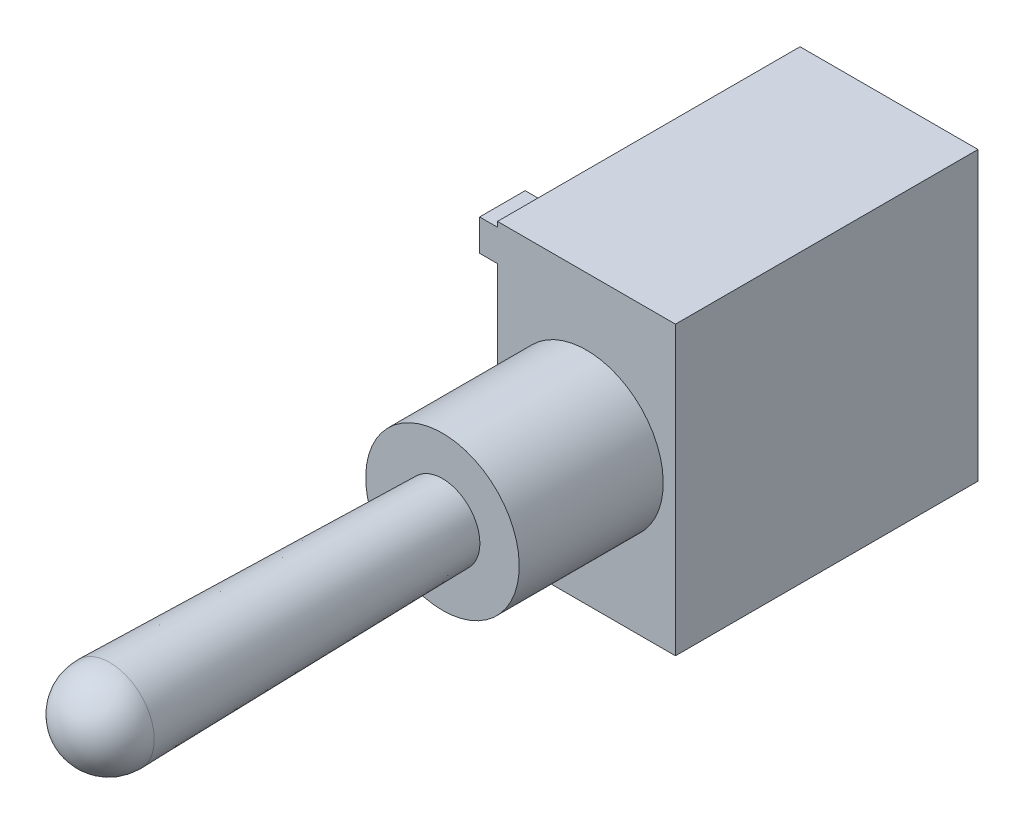
ISO-10303-21;
HEADER;
FILE_DESCRIPTION(('STEP AP214'),'2;1');
FILE_NAME('part.step','',(''),(''),'','','');
FILE_SCHEMA(('AUTOMOTIVE_DESIGN { 1 0 10303 214 1 1 1 1 }'));
ENDSEC;
DATA;
#1=APPLICATION_CONTEXT('core data for automotive mechanical design processes');
#2=APPLICATION_PROTOCOL_DEFINITION('international standard','automotive_design',2000,#1);
#3=PRODUCT_CONTEXT('',#1,'mechanical');
#4=PRODUCT('Part','Part','',(#3));
#5=PRODUCT_RELATED_PRODUCT_CATEGORY('part','',(#4));
#6=PRODUCT_DEFINITION_FORMATION('','',#4);
#7=PRODUCT_DEFINITION_CONTEXT('part definition',#1,'design');
#8=PRODUCT_DEFINITION('design','',#6,#7);
#9=PRODUCT_DEFINITION_SHAPE('','',#8);
#10=(LENGTH_UNIT() NAMED_UNIT(*) SI_UNIT(.MILLI.,.METRE.));
#11=(NAMED_UNIT(*) PLANE_ANGLE_UNIT() SI_UNIT($,.RADIAN.));
#12=(NAMED_UNIT(*) SI_UNIT($,.STERADIAN.) SOLID_ANGLE_UNIT());
#13=UNCERTAINTY_MEASURE_WITH_UNIT(LENGTH_MEASURE(1.E-05),#10,'distance_accuracy_value','');
#14=(GEOMETRIC_REPRESENTATION_CONTEXT(3) GLOBAL_UNCERTAINTY_ASSIGNED_CONTEXT((#13)) GLOBAL_UNIT_ASSIGNED_CONTEXT((#10,
#11,#12)) REPRESENTATION_CONTEXT('',''));
#15=CARTESIAN_POINT('',(0.,0.,0.));
#16=DIRECTION('',(0.,0.,1.));
#17=DIRECTION('',(1.,0.,0.));
#18=AXIS2_PLACEMENT_3D('',#15,#16,#17);
#19=CARTESIAN_POINT('',(97.3307465105003,88.7856999991012,66.3229601149979));
#20=DIRECTION('',(-1.,0.,0.));
#21=DIRECTION('',(0.,1.,0.));
#22=AXIS2_PLACEMENT_3D('',#19,#20,#21);
#23=PLANE('',#22);
#24=DIRECTION('',(0.,0.,1.));
#25=VECTOR('',#24,1.);
#26=CARTESIAN_POINT('',(97.3307465105005,84.8304999991013,74.9589601149979));
#27=LINE('',#26,#25);
#28=CARTESIAN_POINT('',(97.3307465105004,84.8304999991012,73.6589601149979));
#29=VERTEX_POINT('',#28);
#30=CARTESIAN_POINT('',(97.3307465105005,84.8304999991013,74.9589601149979));
#31=VERTEX_POINT('',#30);
#32=EDGE_CURVE('E259',#29,#31,#27,.T.);
#33=ORIENTED_EDGE('',*,*,#32,.T.);
#34=DIRECTION('',(0.,1.,0.));
#35=VECTOR('',#34,1.);
#36=CARTESIAN_POINT('',(97.3307465105005,85.7304999991013,74.9589601149979));
#37=LINE('',#36,#35);
#38=CARTESIAN_POINT('',(97.3307465105005,85.7304999991013,74.9589601149979));
#39=VERTEX_POINT('',#38);
#40=EDGE_CURVE('E165',#31,#39,#37,.T.);
#41=ORIENTED_EDGE('',*,*,#40,.T.);
#42=DIRECTION('',(0.,0.,-1.));
#43=VECTOR('',#42,1.);
#44=CARTESIAN_POINT('',(97.3307465105005,85.7304999991013,74.9589601149979));
#45=LINE('',#44,#43);
#46=CARTESIAN_POINT('',(97.3307465105004,85.7304999991013,73.6589601149979));
#47=VERTEX_POINT('',#46);
#48=EDGE_CURVE('E207',#39,#47,#45,.T.);
#49=ORIENTED_EDGE('',*,*,#48,.T.);
#50=DIRECTION('',(0.,-1.,0.));
#51=VECTOR('',#50,1.);
#52=CARTESIAN_POINT('',(97.3307465105004,85.7304999991013,73.6589601149979));
#53=LINE('',#52,#51);
#54=EDGE_CURVE('E221',#47,#29,#53,.T.);
#55=ORIENTED_EDGE('',*,*,#54,.T.);
#56=EDGE_LOOP('',(#33,#41,#49,#55));
#57=FACE_BOUND('',#56,.T.);
#58=ADVANCED_FACE('F17',(#57),#23,.T.);
#59=CARTESIAN_POINT('',(97.3307465105003,88.7856999991012,66.3229601149979));
#60=DIRECTION('',(-1.,0.,0.));
#61=DIRECTION('',(0.,1.,0.));
#62=AXIS2_PLACEMENT_3D('',#59,#60,#61);
#63=PLANE('',#62);
#64=DIRECTION('',(0.,0.,-1.));
#65=VECTOR('',#64,1.);
#66=CARTESIAN_POINT('',(97.3307465105004,92.7408999991013,73.6589601149979));
#67=LINE('',#66,#65);
#68=CARTESIAN_POINT('',(97.3307465105004,92.7408999991013,74.9589601149979));
#69=VERTEX_POINT('',#68);
#70=CARTESIAN_POINT('',(97.3307465105004,92.7408999991013,73.6589601149979));
#71=VERTEX_POINT('',#70);
#72=EDGE_CURVE('E232',#69,#71,#67,.T.);
#73=ORIENTED_EDGE('',*,*,#72,.T.);
#74=DIRECTION('',(0.,-1.,0.));
#75=VECTOR('',#74,1.);
#76=CARTESIAN_POINT('',(97.3307465105004,91.8408999991013,73.6589601149979));
#77=LINE('',#76,#75);
#78=CARTESIAN_POINT('',(97.3307465105004,91.8408999991013,73.6589601149979));
#79=VERTEX_POINT('',#78);
#80=EDGE_CURVE('E11',#71,#79,#77,.T.);
#81=ORIENTED_EDGE('',*,*,#80,.T.);
#82=DIRECTION('',(0.,0.,1.));
#83=VECTOR('',#82,1.);
#84=CARTESIAN_POINT('',(97.3307465105004,91.8408999991013,73.6589601149979));
#85=LINE('',#84,#83);
#86=CARTESIAN_POINT('',(97.3307465105004,91.8408999991013,74.9589601149979));
#87=VERTEX_POINT('',#86);
#88=EDGE_CURVE('E205',#79,#87,#85,.T.);
#89=ORIENTED_EDGE('',*,*,#88,.T.);
#90=DIRECTION('',(0.,1.,0.));
#91=VECTOR('',#90,1.);
#92=CARTESIAN_POINT('',(97.3307465105004,91.8408999991013,74.9589601149979));
#93=LINE('',#92,#91);
#94=EDGE_CURVE('E204',#87,#69,#93,.T.);
#95=ORIENTED_EDGE('',*,*,#94,.T.);
#96=EDGE_LOOP('',(#73,#81,#89,#95));
#97=FACE_BOUND('',#96,.T.);
#98=ADVANCED_FACE('F357',(#97),#63,.T.);
#99=CARTESIAN_POINT('',(97.3307465105004,91.8408999991013,73.6589601149979));
#100=DIRECTION('',(0.,0.,1.));
#101=DIRECTION('',(1.,0.,0.));
#102=AXIS2_PLACEMENT_3D('',#99,#100,#101);
#103=PLANE('',#102);
#104=DIRECTION('',(0.,-1.,0.));
#105=VECTOR('',#104,1.);
#106=CARTESIAN_POINT('',(97.8407465105004,91.8408999991013,73.6589601149979));
#107=LINE('',#106,#105);
#108=CARTESIAN_POINT('',(97.8407465105004,92.7408999991013,73.6589601149979));
#109=VERTEX_POINT('',#108);
#110=CARTESIAN_POINT('',(97.8407465105004,91.8408999991013,73.6589601149979));
#111=VERTEX_POINT('',#110);
#112=EDGE_CURVE('E256',#109,#111,#107,.T.);
#113=ORIENTED_EDGE('',*,*,#112,.T.);
#114=DIRECTION('',(1.,0.,0.));
#115=VECTOR('',#114,1.);
#116=CARTESIAN_POINT('',(97.3307465105004,91.8408999991013,73.6589601149979));
#117=LINE('',#116,#115);
#118=EDGE_CURVE('E21',#79,#111,#117,.T.);
#119=ORIENTED_EDGE('',*,*,#118,.F.);
#120=ORIENTED_EDGE('',*,*,#80,.F.);
#121=DIRECTION('',(1.,0.,0.));
#122=VECTOR('',#121,1.);
#123=CARTESIAN_POINT('',(97.3307465105004,92.7408999991013,73.6589601149979));
#124=LINE('',#123,#122);
#125=EDGE_CURVE('E169',#71,#109,#124,.T.);
#126=ORIENTED_EDGE('',*,*,#125,.T.);
#127=EDGE_LOOP('',(#113,#119,#120,#126));
#128=FACE_BOUND('',#127,.T.);
#129=ADVANCED_FACE('F362',(#128),#103,.F.);
#130=CARTESIAN_POINT('',(97.3307465105004,91.8408999991013,73.6589601149979));
#131=DIRECTION('',(0.,1.,0.));
#132=DIRECTION('',(0.,0.,-1.));
#133=AXIS2_PLACEMENT_3D('',#130,#131,#132);
#134=PLANE('',#133);
#135=DIRECTION('',(0.,0.,1.));
#136=VECTOR('',#135,1.);
#137=CARTESIAN_POINT('',(97.8407465105004,91.8408999991013,73.6589601149979));
#138=LINE('',#137,#136);
#139=CARTESIAN_POINT('',(97.8407465105004,91.8408999991013,74.9589601149979));
#140=VERTEX_POINT('',#139);
#141=EDGE_CURVE('E199',#111,#140,#138,.T.);
#142=ORIENTED_EDGE('',*,*,#141,.T.);
#143=DIRECTION('',(1.,0.,0.));
#144=VECTOR('',#143,1.);
#145=CARTESIAN_POINT('',(97.3307465105004,91.8408999991013,74.9589601149979));
#146=LINE('',#145,#144);
#147=EDGE_CURVE('E201',#87,#140,#146,.T.);
#148=ORIENTED_EDGE('',*,*,#147,.F.);
#149=ORIENTED_EDGE('',*,*,#88,.F.);
#150=ORIENTED_EDGE('',*,*,#118,.T.);
#151=EDGE_LOOP('',(#142,#148,#149,#150));
#152=FACE_BOUND('',#151,.T.);
#153=ADVANCED_FACE('F367',(#152),#134,.F.);
#154=CARTESIAN_POINT('',(97.3307465105005,85.7304999991013,74.9589601149979));
#155=DIRECTION('',(0.,-1.,0.));
#156=DIRECTION('',(-1.,0.,0.));
#157=AXIS2_PLACEMENT_3D('',#154,#155,#156);
#158=PLANE('',#157);
#159=DIRECTION('',(0.,0.,-1.));
#160=VECTOR('',#159,1.);
#161=CARTESIAN_POINT('',(97.8407465105005,85.7304999991013,74.9589601149979));
#162=LINE('',#161,#160);
#163=CARTESIAN_POINT('',(97.8407465105005,85.7304999991013,74.9589601149979));
#164=VERTEX_POINT('',#163);
#165=CARTESIAN_POINT('',(97.8407465105005,85.7304999991013,73.6589601149979));
#166=VERTEX_POINT('',#165);
#167=EDGE_CURVE('E200',#164,#166,#162,.T.);
#168=ORIENTED_EDGE('',*,*,#167,.T.);
#169=DIRECTION('',(1.,0.,0.));
#170=VECTOR('',#169,1.);
#171=CARTESIAN_POINT('',(97.3307465105004,85.7304999991013,73.6589601149979));
#172=LINE('',#171,#170);
#173=EDGE_CURVE('E214',#47,#166,#172,.T.);
#174=ORIENTED_EDGE('',*,*,#173,.F.);
#175=ORIENTED_EDGE('',*,*,#48,.F.);
#176=DIRECTION('',(1.,0.,0.));
#177=VECTOR('',#176,1.);
#178=CARTESIAN_POINT('',(97.3307465105005,85.7304999991013,74.9589601149979));
#179=LINE('',#178,#177);
#180=EDGE_CURVE('E203',#39,#164,#179,.T.);
#181=ORIENTED_EDGE('',*,*,#180,.T.);
#182=EDGE_LOOP('',(#168,#174,#175,#181));
#183=FACE_BOUND('',#182,.T.);
#184=ADVANCED_FACE('F369',(#183),#158,.F.);
#185=CARTESIAN_POINT('',(97.3307465105004,85.7304999991013,73.6589601149979));
#186=DIRECTION('',(0.,0.,1.));
#187=DIRECTION('',(1.,0.,0.));
#188=AXIS2_PLACEMENT_3D('',#185,#186,#187);
#189=PLANE('',#188);
#190=DIRECTION('',(0.,-1.,0.));
#191=VECTOR('',#190,1.);
#192=CARTESIAN_POINT('',(97.8407465105005,85.7304999991013,73.6589601149979));
#193=LINE('',#192,#191);
#194=CARTESIAN_POINT('',(97.8407465105005,84.8304999991012,73.6589601149979));
#195=VERTEX_POINT('',#194);
#196=EDGE_CURVE('E180',#166,#195,#193,.T.);
#197=ORIENTED_EDGE('',*,*,#196,.T.);
#198=DIRECTION('',(1.,0.,0.));
#199=VECTOR('',#198,1.);
#200=CARTESIAN_POINT('',(97.3307465105004,84.8304999991012,73.6589601149979));
#201=LINE('',#200,#199);
#202=EDGE_CURVE('E175',#29,#195,#201,.T.);
#203=ORIENTED_EDGE('',*,*,#202,.F.);
#204=ORIENTED_EDGE('',*,*,#54,.F.);
#205=ORIENTED_EDGE('',*,*,#173,.T.);
#206=EDGE_LOOP('',(#197,#203,#204,#205));
#207=FACE_BOUND('',#206,.T.);
#208=ADVANCED_FACE('F385',(#207),#189,.F.);
#209=CARTESIAN_POINT('',(97.3307465105005,84.8304999991013,74.9589601149979));
#210=DIRECTION('',(0.,1.,0.));
#211=DIRECTION('',(0.,0.,-1.));
#212=AXIS2_PLACEMENT_3D('',#209,#210,#211);
#213=PLANE('',#212);
#214=DIRECTION('',(0.,0.,1.));
#215=VECTOR('',#214,1.);
#216=CARTESIAN_POINT('',(97.8407465105005,84.8304999991013,74.9589601149979));
#217=LINE('',#216,#215);
#218=CARTESIAN_POINT('',(97.8407465105005,84.8304999991013,74.9589601149979));
#219=VERTEX_POINT('',#218);
#220=EDGE_CURVE('E172',#195,#219,#217,.T.);
#221=ORIENTED_EDGE('',*,*,#220,.T.);
#222=DIRECTION('',(1.,0.,0.));
#223=VECTOR('',#222,1.);
#224=CARTESIAN_POINT('',(97.3307465105005,84.8304999991013,74.9589601149979));
#225=LINE('',#224,#223);
#226=EDGE_CURVE('E157',#31,#219,#225,.T.);
#227=ORIENTED_EDGE('',*,*,#226,.F.);
#228=ORIENTED_EDGE('',*,*,#32,.F.);
#229=ORIENTED_EDGE('',*,*,#202,.T.);
#230=EDGE_LOOP('',(#221,#227,#228,#229));
#231=FACE_BOUND('',#230,.T.);
#232=ADVANCED_FACE('F173',(#231),#213,.F.);
#233=CARTESIAN_POINT('',(97.3307465105004,92.7408999991013,73.6589601149979));
#234=DIRECTION('',(0.,-1.,0.));
#235=DIRECTION('',(-1.,0.,0.));
#236=AXIS2_PLACEMENT_3D('',#233,#234,#235);
#237=PLANE('',#236);
#238=DIRECTION('',(0.,0.,-1.));
#239=VECTOR('',#238,1.);
#240=CARTESIAN_POINT('',(97.8407465105004,92.7408999991013,73.6589601149979));
#241=LINE('',#240,#239);
#242=CARTESIAN_POINT('',(97.8407465105004,92.7408999991013,74.9589601149979));
#243=VERTEX_POINT('',#242);
#244=EDGE_CURVE('E271',#243,#109,#241,.T.);
#245=ORIENTED_EDGE('',*,*,#244,.T.);
#246=ORIENTED_EDGE('',*,*,#125,.F.);
#247=ORIENTED_EDGE('',*,*,#72,.F.);
#248=DIRECTION('',(1.,0.,0.));
#249=VECTOR('',#248,1.);
#250=CARTESIAN_POINT('',(97.3307465105004,92.7408999991013,74.9589601149979));
#251=LINE('',#250,#249);
#252=EDGE_CURVE('E262',#69,#243,#251,.T.);
#253=ORIENTED_EDGE('',*,*,#252,.T.);
#254=EDGE_LOOP('',(#245,#246,#247,#253));
#255=FACE_BOUND('',#254,.T.);
#256=ADVANCED_FACE('F287',(#255),#237,.F.);
#257=CARTESIAN_POINT('',(100.3807465105,88.7856999991013,74.9589601149979));
#258=DIRECTION('',(0.,0.,1.));
#259=DIRECTION('',(1.,0.,0.));
#260=AXIS2_PLACEMENT_3D('',#257,#258,#259);
#261=PLANE('',#260);
#262=CARTESIAN_POINT('',(100.3807465105,88.7856999991013,74.9589601149979));
#263=DIRECTION('',(0.,0.,1.));
#264=DIRECTION('',(0.,-1.,0.));
#265=AXIS2_PLACEMENT_3D('',#262,#263,#264);
#266=CIRCLE('',#265,2.19075);
#267=CARTESIAN_POINT('',(100.3807465105,86.5949499991013,74.9589601149979));
#268=VERTEX_POINT('',#267);
#269=EDGE_CURVE('E224',#268,#268,#266,.T.);
#270=ORIENTED_EDGE('',*,*,#269,.F.);
#271=EDGE_LOOP('',(#270));
#272=FACE_BOUND('',#271,.T.);
#273=DIRECTION('',(1.,0.,0.));
#274=VECTOR('',#273,1.);
#275=CARTESIAN_POINT('',(102.9207465105,84.6856999991013,74.9589601149979));
#276=LINE('',#275,#274);
#277=CARTESIAN_POINT('',(97.8407465105005,84.6856999991013,74.9589601149979));
#278=VERTEX_POINT('',#277);
#279=CARTESIAN_POINT('',(102.9207465105,84.6856999991013,74.9589601149979));
#280=VERTEX_POINT('',#279);
#281=EDGE_CURVE('E295',#278,#280,#276,.T.);
#282=ORIENTED_EDGE('',*,*,#281,.T.);
#283=DIRECTION('',(0.,1.,0.));
#284=VECTOR('',#283,1.);
#285=CARTESIAN_POINT('',(102.9207465105,92.8856999991013,74.9589601149978));
#286=LINE('',#285,#284);
#287=CARTESIAN_POINT('',(102.9207465105,92.8856999991013,74.9589601149978));
#288=VERTEX_POINT('',#287);
#289=EDGE_CURVE('E244',#280,#288,#286,.T.);
#290=ORIENTED_EDGE('',*,*,#289,.T.);
#291=DIRECTION('',(-1.,0.,0.));
#292=VECTOR('',#291,1.);
#293=CARTESIAN_POINT('',(102.9207465105,92.8856999991013,74.9589601149978));
#294=LINE('',#293,#292);
#295=CARTESIAN_POINT('',(97.8407465105004,92.8856999991013,74.9589601149979));
#296=VERTEX_POINT('',#295);
#297=EDGE_CURVE('E245',#288,#296,#294,.T.);
#298=ORIENTED_EDGE('',*,*,#297,.T.);
#299=DIRECTION('',(0.,-1.,0.));
#300=VECTOR('',#299,1.);
#301=CARTESIAN_POINT('',(97.8407465105004,92.8856999991013,74.9589601149979));
#302=LINE('',#301,#300);
#303=EDGE_CURVE('E191',#296,#243,#302,.T.);
#304=ORIENTED_EDGE('',*,*,#303,.T.);
#305=ORIENTED_EDGE('',*,*,#252,.F.);
#306=ORIENTED_EDGE('',*,*,#94,.F.);
#307=ORIENTED_EDGE('',*,*,#147,.T.);
#308=DIRECTION('',(0.,-1.,0.));
#309=VECTOR('',#308,1.);
#310=CARTESIAN_POINT('',(97.8407465105004,92.8856999991013,74.9589601149979));
#311=LINE('',#310,#309);
#312=EDGE_CURVE('E196',#140,#164,#311,.T.);
#313=ORIENTED_EDGE('',*,*,#312,.T.);
#314=ORIENTED_EDGE('',*,*,#180,.F.);
#315=ORIENTED_EDGE('',*,*,#40,.F.);
#316=ORIENTED_EDGE('',*,*,#226,.T.);
#317=DIRECTION('',(0.,-1.,0.));
#318=VECTOR('',#317,1.);
#319=CARTESIAN_POINT('',(97.8407465105004,92.8856999991013,74.9589601149979));
#320=LINE('',#319,#318);
#321=EDGE_CURVE('E162',#219,#278,#320,.T.);
#322=ORIENTED_EDGE('',*,*,#321,.T.);
#323=EDGE_LOOP('',(#282,#290,#298,#304,#305,#306,#307,#313,#314,#315,#316,#322));
#324=FACE_BOUND('',#323,.T.);
#325=ADVANCED_FACE('F160',(#272,#324),#261,.T.);
#326=CARTESIAN_POINT('',(100.380746510501,88.7856999991013,79.0689601149979));
#327=DIRECTION('',(0.,0.,1.));
#328=DIRECTION('',(1.,0.,0.));
#329=AXIS2_PLACEMENT_3D('',#326,#327,#328);
#330=PLANE('',#329);
#331=CARTESIAN_POINT('',(100.380746510501,88.7856999991013,79.0689601149979));
#332=DIRECTION('',(0.,0.,1.));
#333=DIRECTION('',(0.,-1.,0.));
#334=AXIS2_PLACEMENT_3D('',#331,#332,#333);
#335=CIRCLE('',#334,1.0668);
#336=CARTESIAN_POINT('',(100.380746510501,89.8524999991013,79.0689601149979));
#337=VERTEX_POINT('',#336);
#338=EDGE_CURVE('E268',#337,#337,#335,.T.);
#339=ORIENTED_EDGE('',*,*,#338,.F.);
#340=EDGE_LOOP('',(#339));
#341=FACE_BOUND('',#340,.T.);
#342=CARTESIAN_POINT('',(100.380746510501,88.7856999991013,79.0689601149979));
#343=DIRECTION('',(0.,0.,1.));
#344=DIRECTION('',(0.,-1.,0.));
#345=AXIS2_PLACEMENT_3D('',#342,#343,#344);
#346=CIRCLE('',#345,2.19075);
#347=CARTESIAN_POINT('',(100.380746510501,86.5949499991013,79.0689601149979));
#348=VERTEX_POINT('',#347);
#349=EDGE_CURVE('E226',#348,#348,#346,.T.);
#350=ORIENTED_EDGE('',*,*,#349,.T.);
#351=EDGE_LOOP('',(#350));
#352=FACE_BOUND('',#351,.T.);
#353=ADVANCED_FACE('F354',(#341,#352),#330,.T.);
#354=CARTESIAN_POINT('',(102.9207465105,92.8856999991013,74.9589601149978));
#355=DIRECTION('',(-1.,0.,0.));
#356=DIRECTION('',(0.,1.,0.));
#357=AXIS2_PLACEMENT_3D('',#354,#355,#356);
#358=PLANE('',#357);
#359=DIRECTION('',(0.,1.,0.));
#360=VECTOR('',#359,1.);
#361=CARTESIAN_POINT('',(102.9207465105,92.8856999991012,66.3229601149978));
#362=LINE('',#361,#360);
#363=CARTESIAN_POINT('',(102.9207465105,84.6856999991012,66.3229601149979));
#364=VERTEX_POINT('',#363);
#365=CARTESIAN_POINT('',(102.9207465105,92.8856999991012,66.3229601149978));
#366=VERTEX_POINT('',#365);
#367=EDGE_CURVE('E263',#364,#366,#362,.T.);
#368=ORIENTED_EDGE('',*,*,#367,.T.);
#369=DIRECTION('',(0.,0.,-1.));
#370=VECTOR('',#369,1.);
#371=CARTESIAN_POINT('',(102.9207465105,92.8856999991013,74.9589601149978));
#372=LINE('',#371,#370);
#373=EDGE_CURVE('E241',#288,#366,#372,.T.);
#374=ORIENTED_EDGE('',*,*,#373,.F.);
#375=ORIENTED_EDGE('',*,*,#289,.F.);
#376=DIRECTION('',(0.,0.,-1.));
#377=VECTOR('',#376,1.);
#378=CARTESIAN_POINT('',(102.9207465105,84.6856999991013,74.9589601149979));
#379=LINE('',#378,#377);
#380=EDGE_CURVE('E267',#280,#364,#379,.T.);
#381=ORIENTED_EDGE('',*,*,#380,.T.);
#382=EDGE_LOOP('',(#368,#374,#375,#381));
#383=FACE_BOUND('',#382,.T.);
#384=ADVANCED_FACE('F337',(#383),#358,.F.);
#385=CARTESIAN_POINT('',(102.9207465105,92.8856999991013,74.9589601149978));
#386=DIRECTION('',(0.,-1.,0.));
#387=DIRECTION('',(-1.,0.,0.));
#388=AXIS2_PLACEMENT_3D('',#385,#386,#387);
#389=PLANE('',#388);
#390=DIRECTION('',(-1.,0.,0.));
#391=VECTOR('',#390,1.);
#392=CARTESIAN_POINT('',(102.9207465105,92.8856999991012,66.3229601149978));
#393=LINE('',#392,#391);
#394=CARTESIAN_POINT('',(97.8407465105003,92.8856999991012,66.3229601149979));
#395=VERTEX_POINT('',#394);
#396=EDGE_CURVE('E239',#366,#395,#393,.T.);
#397=ORIENTED_EDGE('',*,*,#396,.T.);
#398=DIRECTION('',(0.,0.,-1.));
#399=VECTOR('',#398,1.);
#400=CARTESIAN_POINT('',(97.8407465105004,92.8856999991013,74.9589601149979));
#401=LINE('',#400,#399);
#402=EDGE_CURVE('E185',#296,#395,#401,.T.);
#403=ORIENTED_EDGE('',*,*,#402,.F.);
#404=ORIENTED_EDGE('',*,*,#297,.F.);
#405=ORIENTED_EDGE('',*,*,#373,.T.);
#406=EDGE_LOOP('',(#397,#403,#404,#405));
#407=FACE_BOUND('',#406,.T.);
#408=ADVANCED_FACE('F19',(#407),#389,.F.);
#409=CARTESIAN_POINT('',(97.8407465105004,92.8856999991013,74.9589601149979));
#410=DIRECTION('',(1.,0.,0.));
#411=DIRECTION('',(0.,0.,-1.));
#412=AXIS2_PLACEMENT_3D('',#409,#410,#411);
#413=PLANE('',#412);
#414=ORIENTED_EDGE('',*,*,#244,.F.);
#415=ORIENTED_EDGE('',*,*,#303,.F.);
#416=ORIENTED_EDGE('',*,*,#402,.T.);
#417=DIRECTION('',(0.,-1.,0.));
#418=VECTOR('',#417,1.);
#419=CARTESIAN_POINT('',(97.8407465105003,92.8856999991012,66.3229601149979));
#420=LINE('',#419,#418);
#421=CARTESIAN_POINT('',(97.8407465105004,84.6856999991012,66.3229601149979));
#422=VERTEX_POINT('',#421);
#423=EDGE_CURVE('E236',#395,#422,#420,.T.);
#424=ORIENTED_EDGE('',*,*,#423,.T.);
#425=DIRECTION('',(0.,0.,-1.));
#426=VECTOR('',#425,1.);
#427=CARTESIAN_POINT('',(97.8407465105005,84.6856999991013,74.9589601149979));
#428=LINE('',#427,#426);
#429=EDGE_CURVE('E62',#278,#422,#428,.T.);
#430=ORIENTED_EDGE('',*,*,#429,.F.);
#431=ORIENTED_EDGE('',*,*,#321,.F.);
#432=ORIENTED_EDGE('',*,*,#220,.F.);
#433=ORIENTED_EDGE('',*,*,#196,.F.);
#434=ORIENTED_EDGE('',*,*,#167,.F.);
#435=ORIENTED_EDGE('',*,*,#312,.F.);
#436=ORIENTED_EDGE('',*,*,#141,.F.);
#437=ORIENTED_EDGE('',*,*,#112,.F.);
#438=EDGE_LOOP('',(#414,#415,#416,#424,#430,#431,#432,#433,#434,#435,#436,#437));
#439=FACE_BOUND('',#438,.T.);
#440=ADVANCED_FACE('F183',(#439),#413,.F.);
#441=CARTESIAN_POINT('',(102.9207465105,84.6856999991013,74.9589601149979));
#442=DIRECTION('',(0.,1.,0.));
#443=DIRECTION('',(0.,0.,-1.));
#444=AXIS2_PLACEMENT_3D('',#441,#442,#443);
#445=PLANE('',#444);
#446=DIRECTION('',(1.,0.,0.));
#447=VECTOR('',#446,1.);
#448=CARTESIAN_POINT('',(102.9207465105,84.6856999991012,66.3229601149979));
#449=LINE('',#448,#447);
#450=EDGE_CURVE('E240',#422,#364,#449,.T.);
#451=ORIENTED_EDGE('',*,*,#450,.T.);
#452=ORIENTED_EDGE('',*,*,#380,.F.);
#453=ORIENTED_EDGE('',*,*,#281,.F.);
#454=ORIENTED_EDGE('',*,*,#429,.T.);
#455=EDGE_LOOP('',(#451,#452,#453,#454));
#456=FACE_BOUND('',#455,.T.);
#457=ADVANCED_FACE('F340',(#456),#445,.F.);
#458=CARTESIAN_POINT('',(100.3807465105,88.7856999991012,66.3229601149979));
#459=DIRECTION('',(0.,0.,1.));
#460=DIRECTION('',(1.,0.,0.));
#461=AXIS2_PLACEMENT_3D('',#458,#459,#460);
#462=PLANE('',#461);
#463=CARTESIAN_POINT('',(100.3807465105,88.7856999991012,66.3229601149979));
#464=DIRECTION('',(0.,0.,1.));
#465=DIRECTION('',(0.,-1.,0.));
#466=AXIS2_PLACEMENT_3D('',#463,#464,#465);
#467=CIRCLE('',#466,1.0668);
#468=CARTESIAN_POINT('',(100.3807465105,89.8524999991012,66.3229601149979));
#469=VERTEX_POINT('',#468);
#470=EDGE_CURVE('E76',#469,#469,#467,.T.);
#471=ORIENTED_EDGE('',*,*,#470,.T.);
#472=EDGE_LOOP('',(#471));
#473=FACE_BOUND('',#472,.T.);
#474=ORIENTED_EDGE('',*,*,#450,.F.);
#475=ORIENTED_EDGE('',*,*,#423,.F.);
#476=ORIENTED_EDGE('',*,*,#396,.F.);
#477=ORIENTED_EDGE('',*,*,#367,.F.);
#478=EDGE_LOOP('',(#474,#475,#476,#477));
#479=FACE_BOUND('',#478,.T.);
#480=ADVANCED_FACE('F344',(#473,#479),#462,.F.);
#481=CARTESIAN_POINT('',(100.3807465105,88.7856999991012,66.3129601149979));
#482=DIRECTION('',(0.,0.,1.));
#483=DIRECTION('',(0.,-1.,0.));
#484=AXIS2_PLACEMENT_3D('',#481,#482,#483);
#485=CYLINDRICAL_SURFACE('',#484,1.0668);
#486=ORIENTED_EDGE('',*,*,#470,.F.);
#487=EDGE_LOOP('',(#486));
#488=FACE_BOUND('',#487,.T.);
#489=CARTESIAN_POINT('',(100.3807465105,88.7856999991013,77.5689601149979));
#490=DIRECTION('',(0.,0.,1.));
#491=DIRECTION('',(0.,-1.,0.));
#492=AXIS2_PLACEMENT_3D('',#489,#490,#491);
#493=CIRCLE('',#492,1.0668);
#494=CARTESIAN_POINT('',(100.3807465105,89.8524999991013,77.5689601149979));
#495=VERTEX_POINT('',#494);
#496=EDGE_CURVE('E230',#495,#495,#493,.T.);
#497=ORIENTED_EDGE('',*,*,#496,.T.);
#498=EDGE_LOOP('',(#497));
#499=FACE_BOUND('',#498,.T.);
#500=ADVANCED_FACE('F375',(#488,#499),#485,.F.);
#501=CARTESIAN_POINT('',(100.380746510501,88.7856999991013,79.0689601149979));
#502=DIRECTION('',(0.,0.,-1.));
#503=DIRECTION('',(0.,1.,0.));
#504=AXIS2_PLACEMENT_3D('',#501,#502,#503);
#505=CYLINDRICAL_SURFACE('',#504,2.19075);
#506=ORIENTED_EDGE('',*,*,#269,.T.);
#507=EDGE_LOOP('',(#506));
#508=FACE_BOUND('',#507,.T.);
#509=ORIENTED_EDGE('',*,*,#349,.F.);
#510=EDGE_LOOP('',(#509));
#511=FACE_BOUND('',#510,.T.);
#512=ADVANCED_FACE('F372',(#508,#511),#505,.T.);
#513=CARTESIAN_POINT('',(101.8139465105,90.0659906350898,77.5689601149978));
#514=DIRECTION('',(0.,0.,1.));
#515=DIRECTION('',(1.,0.,0.));
#516=AXIS2_PLACEMENT_3D('',#513,#514,#515);
#517=PLANE('',#516);
#518=ORIENTED_EDGE('',*,*,#496,.F.);
#519=EDGE_LOOP('',(#518));
#520=FACE_BOUND('',#519,.T.);
#521=ADVANCED_FACE('F374',(#520),#517,.F.);
#522=CARTESIAN_POINT('',(100.380746510501,88.7856999991014,88.5936694790094));
#523=DIRECTION('',(-1.,0.,0.));
#524=DIRECTION('',(0.,-1.,0.));
#525=AXIS2_PLACEMENT_3D('',#522,#523,#524);
#526=SPHERICAL_SURFACE('',#525,1.27029063598844);
#527=CARTESIAN_POINT('',(100.380746510501,88.7856999991014,88.5936694790094));
#528=DIRECTION('',(0.,0.,-1.));
#529=DIRECTION('',(0.,1.,0.));
#530=AXIS2_PLACEMENT_3D('',#527,#528,#529);
#531=SPHERICAL_SURFACE('',#530,1.27029063598844);
#532=CARTESIAN_POINT('',(100.380746510501,88.7856999991014,88.5664978047893));
#533=DIRECTION('',(0.,0.,-1.));
#534=DIRECTION('',(0.,1.,0.));
#535=AXIS2_PLACEMENT_3D('',#532,#533,#534);
#536=CIRCLE('',#535,1.27);
#537=CARTESIAN_POINT('',(100.380746510501,90.0556999991014,88.5664978047893));
#538=VERTEX_POINT('',#537);
#539=EDGE_CURVE('E251',#538,#538,#536,.T.);
#540=ORIENTED_EDGE('',*,*,#539,.F.);
#541=EDGE_LOOP('',(#540));
#542=FACE_BOUND('',#541,.T.);
#543=ADVANCED_FACE('F378',(#542),#531,.T.);
#544=CARTESIAN_POINT('',(100.380746510501,88.7856999991013,79.0689601149979));
#545=DIRECTION('',(0.,0.,1.));
#546=DIRECTION('',(0.,-1.,0.));
#547=AXIS2_PLACEMENT_3D('',#544,#545,#546);
#548=CONICAL_SURFACE('',#547,1.0668,0.0213917554664291);
#549=ORIENTED_EDGE('',*,*,#539,.T.);
#550=EDGE_LOOP('',(#549));
#551=FACE_BOUND('',#550,.T.);
#552=ORIENTED_EDGE('',*,*,#338,.T.);
#553=EDGE_LOOP('',(#552));
#554=FACE_BOUND('',#553,.T.);
#555=ADVANCED_FACE('F381',(#551,#554),#548,.T.);
#556=CLOSED_SHELL('',(#58,#98,#129,#153,#184,#208,#232,#256,#325,#353,#384,#408,#440,#457,#480,
#500,#512,#521,#543,#555));
#557=MANIFOLD_SOLID_BREP('B1',#556);
#558=ADVANCED_BREP_SHAPE_REPRESENTATION('',(#18,#557),#14);
#559=SHAPE_DEFINITION_REPRESENTATION(#9,#558);
ENDSEC;
END-ISO-10303-21;
